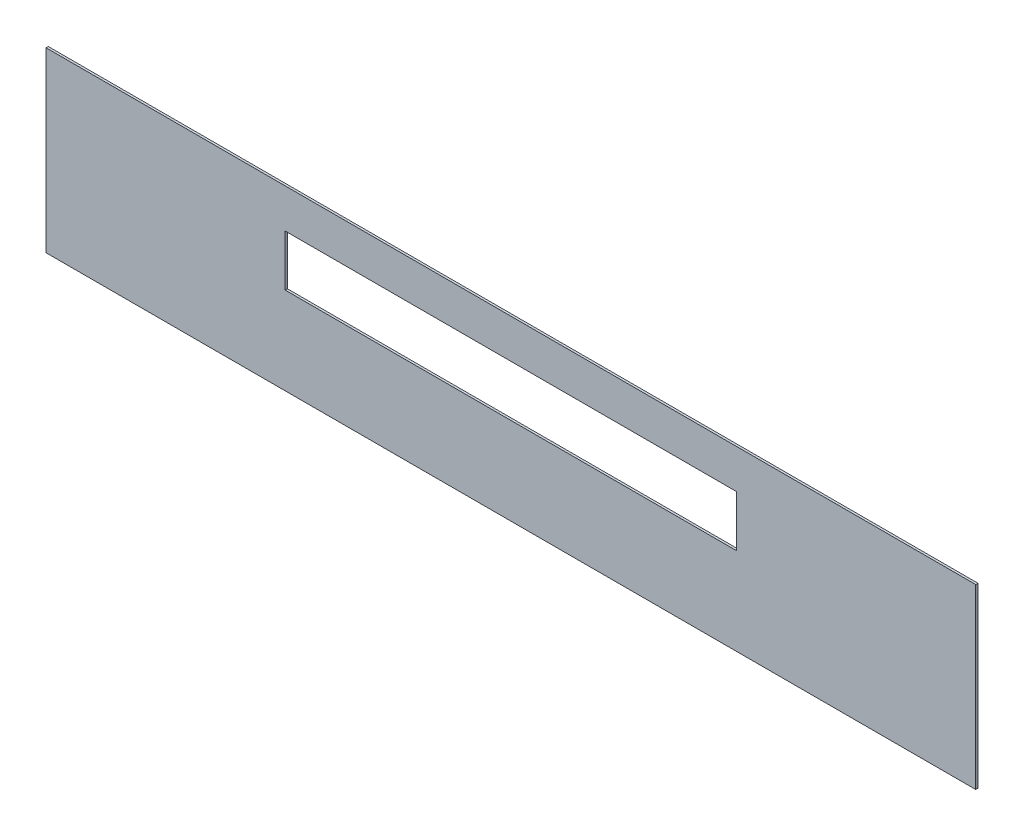
ISO-10303-21;
HEADER;
FILE_DESCRIPTION(('STEP AP214'),'2;1');
FILE_NAME('part.step','',(''),(''),'','','');
FILE_SCHEMA(('AUTOMOTIVE_DESIGN { 1 0 10303 214 1 1 1 1 }'));
ENDSEC;
DATA;
#1=APPLICATION_CONTEXT('core data for automotive mechanical design processes');
#2=APPLICATION_PROTOCOL_DEFINITION('international standard','automotive_design',2000,#1);
#3=PRODUCT_CONTEXT('',#1,'mechanical');
#4=PRODUCT('Part','Part','',(#3));
#5=PRODUCT_RELATED_PRODUCT_CATEGORY('part','',(#4));
#6=PRODUCT_DEFINITION_FORMATION('','',#4);
#7=PRODUCT_DEFINITION_CONTEXT('part definition',#1,'design');
#8=PRODUCT_DEFINITION('design','',#6,#7);
#9=PRODUCT_DEFINITION_SHAPE('','',#8);
#10=(LENGTH_UNIT() NAMED_UNIT(*) SI_UNIT(.MILLI.,.METRE.));
#11=(NAMED_UNIT(*) PLANE_ANGLE_UNIT() SI_UNIT($,.RADIAN.));
#12=(NAMED_UNIT(*) SI_UNIT($,.STERADIAN.) SOLID_ANGLE_UNIT());
#13=UNCERTAINTY_MEASURE_WITH_UNIT(LENGTH_MEASURE(1.E-05),#10,'distance_accuracy_value','');
#14=(GEOMETRIC_REPRESENTATION_CONTEXT(3) GLOBAL_UNCERTAINTY_ASSIGNED_CONTEXT((#13)) GLOBAL_UNIT_ASSIGNED_CONTEXT((#10,
#11,#12)) REPRESENTATION_CONTEXT('',''));
#15=CARTESIAN_POINT('',(0.,0.,0.));
#16=DIRECTION('',(0.,0.,1.));
#17=DIRECTION('',(1.,0.,0.));
#18=AXIS2_PLACEMENT_3D('',#15,#16,#17);
#19=CARTESIAN_POINT('',(0.,0.,40.));
#20=DIRECTION('',(0.,0.,-1.));
#21=DIRECTION('',(-1.,0.,0.));
#22=AXIS2_PLACEMENT_3D('',#19,#20,#21);
#23=PLANE('',#22);
#24=DIRECTION('',(0.,-1.,0.));
#25=VECTOR('',#24,1.);
#26=CARTESIAN_POINT('',(0.,0.,40.));
#27=LINE('',#26,#25);
#28=CARTESIAN_POINT('',(0.,118.,40.));
#29=VERTEX_POINT('',#28);
#30=CARTESIAN_POINT('',(0.,0.,40.));
#31=VERTEX_POINT('',#30);
#32=EDGE_CURVE('E126',#29,#31,#27,.T.);
#33=ORIENTED_EDGE('',*,*,#32,.T.);
#34=DIRECTION('',(1.,0.,0.));
#35=VECTOR('',#34,1.);
#36=CARTESIAN_POINT('',(0.,0.,40.));
#37=LINE('',#36,#35);
#38=CARTESIAN_POINT('',(618.,0.,40.));
#39=VERTEX_POINT('',#38);
#40=EDGE_CURVE('E129',#31,#39,#37,.T.);
#41=ORIENTED_EDGE('',*,*,#40,.T.);
#42=DIRECTION('',(0.,1.,0.));
#43=VECTOR('',#42,1.);
#44=CARTESIAN_POINT('',(618.,0.,40.));
#45=LINE('',#44,#43);
#46=CARTESIAN_POINT('',(618.,118.,40.));
#47=VERTEX_POINT('',#46);
#48=EDGE_CURVE('E132',#39,#47,#45,.T.);
#49=ORIENTED_EDGE('',*,*,#48,.T.);
#50=DIRECTION('',(-1.,0.,0.));
#51=VECTOR('',#50,1.);
#52=CARTESIAN_POINT('',(0.,118.,40.));
#53=LINE('',#52,#51);
#54=EDGE_CURVE('E134',#47,#29,#53,.T.);
#55=ORIENTED_EDGE('',*,*,#54,.T.);
#56=EDGE_LOOP('',(#33,#41,#49,#55));
#57=FACE_BOUND('',#56,.T.);
#58=DIRECTION('',(0.,-1.,0.));
#59=VECTOR('',#58,1.);
#60=CARTESIAN_POINT('',(159.,0.,40.));
#61=LINE('',#60,#59);
#62=CARTESIAN_POINT('',(159.,92.,40.));
#63=VERTEX_POINT('',#62);
#64=CARTESIAN_POINT('',(159.,58.,40.));
#65=VERTEX_POINT('',#64);
#66=EDGE_CURVE('E112',#63,#65,#61,.T.);
#67=ORIENTED_EDGE('',*,*,#66,.F.);
#68=DIRECTION('',(-1.,0.,0.));
#69=VECTOR('',#68,1.);
#70=CARTESIAN_POINT('',(0.,92.,40.));
#71=LINE('',#70,#69);
#72=CARTESIAN_POINT('',(459.,92.,40.));
#73=VERTEX_POINT('',#72);
#74=EDGE_CURVE('E101',#73,#63,#71,.T.);
#75=ORIENTED_EDGE('',*,*,#74,.F.);
#76=DIRECTION('',(0.,1.,0.));
#77=VECTOR('',#76,1.);
#78=CARTESIAN_POINT('',(459.,0.,40.));
#79=LINE('',#78,#77);
#80=CARTESIAN_POINT('',(459.,58.,40.));
#81=VERTEX_POINT('',#80);
#82=EDGE_CURVE('E106',#81,#73,#79,.T.);
#83=ORIENTED_EDGE('',*,*,#82,.F.);
#84=DIRECTION('',(1.,0.,0.));
#85=VECTOR('',#84,1.);
#86=CARTESIAN_POINT('',(0.,58.,40.));
#87=LINE('',#86,#85);
#88=EDGE_CURVE('E117',#65,#81,#87,.T.);
#89=ORIENTED_EDGE('',*,*,#88,.F.);
#90=EDGE_LOOP('',(#67,#75,#83,#89));
#91=FACE_BOUND('',#90,.T.);
#92=ADVANCED_FACE('F39',(#57,#91),#23,.F.);
#93=CARTESIAN_POINT('',(0.,0.,38.5));
#94=DIRECTION('',(0.,0.,-1.));
#95=DIRECTION('',(-1.,0.,0.));
#96=AXIS2_PLACEMENT_3D('',#93,#94,#95);
#97=PLANE('',#96);
#98=DIRECTION('',(0.,-1.,0.));
#99=VECTOR('',#98,1.);
#100=CARTESIAN_POINT('',(0.,0.,38.5));
#101=LINE('',#100,#99);
#102=CARTESIAN_POINT('',(0.,118.,38.5));
#103=VERTEX_POINT('',#102);
#104=CARTESIAN_POINT('',(0.,0.,38.5));
#105=VERTEX_POINT('',#104);
#106=EDGE_CURVE('E118',#103,#105,#101,.T.);
#107=ORIENTED_EDGE('',*,*,#106,.F.);
#108=DIRECTION('',(-1.,0.,0.));
#109=VECTOR('',#108,1.);
#110=CARTESIAN_POINT('',(0.,118.,38.5));
#111=LINE('',#110,#109);
#112=CARTESIAN_POINT('',(618.,118.,38.5));
#113=VERTEX_POINT('',#112);
#114=EDGE_CURVE('E130',#113,#103,#111,.T.);
#115=ORIENTED_EDGE('',*,*,#114,.F.);
#116=DIRECTION('',(0.,1.,0.));
#117=VECTOR('',#116,1.);
#118=CARTESIAN_POINT('',(618.,0.,38.5));
#119=LINE('',#118,#117);
#120=CARTESIAN_POINT('',(618.,0.,38.5));
#121=VERTEX_POINT('',#120);
#122=EDGE_CURVE('E138',#121,#113,#119,.T.);
#123=ORIENTED_EDGE('',*,*,#122,.F.);
#124=DIRECTION('',(1.,0.,0.));
#125=VECTOR('',#124,1.);
#126=CARTESIAN_POINT('',(0.,0.,38.5));
#127=LINE('',#126,#125);
#128=EDGE_CURVE('E121',#105,#121,#127,.T.);
#129=ORIENTED_EDGE('',*,*,#128,.F.);
#130=EDGE_LOOP('',(#107,#115,#123,#129));
#131=FACE_BOUND('',#130,.T.);
#132=DIRECTION('',(-1.,0.,0.));
#133=VECTOR('',#132,1.);
#134=CARTESIAN_POINT('',(0.,92.,38.5));
#135=LINE('',#134,#133);
#136=CARTESIAN_POINT('',(459.,92.,38.5));
#137=VERTEX_POINT('',#136);
#138=CARTESIAN_POINT('',(159.,92.,38.5));
#139=VERTEX_POINT('',#138);
#140=EDGE_CURVE('E152',#137,#139,#135,.T.);
#141=ORIENTED_EDGE('',*,*,#140,.T.);
#142=DIRECTION('',(0.,-1.,0.));
#143=VECTOR('',#142,1.);
#144=CARTESIAN_POINT('',(159.,0.,38.5));
#145=LINE('',#144,#143);
#146=CARTESIAN_POINT('',(159.,58.,38.5));
#147=VERTEX_POINT('',#146);
#148=EDGE_CURVE('E11',#139,#147,#145,.T.);
#149=ORIENTED_EDGE('',*,*,#148,.T.);
#150=DIRECTION('',(1.,0.,0.));
#151=VECTOR('',#150,1.);
#152=CARTESIAN_POINT('',(0.,58.,38.5));
#153=LINE('',#152,#151);
#154=CARTESIAN_POINT('',(459.,58.,38.5));
#155=VERTEX_POINT('',#154);
#156=EDGE_CURVE('E47',#147,#155,#153,.T.);
#157=ORIENTED_EDGE('',*,*,#156,.T.);
#158=DIRECTION('',(0.,1.,0.));
#159=VECTOR('',#158,1.);
#160=CARTESIAN_POINT('',(459.,0.,38.5));
#161=LINE('',#160,#159);
#162=EDGE_CURVE('E154',#155,#137,#161,.T.);
#163=ORIENTED_EDGE('',*,*,#162,.T.);
#164=EDGE_LOOP('',(#141,#149,#157,#163));
#165=FACE_BOUND('',#164,.T.);
#166=ADVANCED_FACE('F158',(#131,#165),#97,.T.);
#167=CARTESIAN_POINT('',(0.,0.,40.));
#168=DIRECTION('',(1.,0.,0.));
#169=DIRECTION('',(0.,0.,-1.));
#170=AXIS2_PLACEMENT_3D('',#167,#168,#169);
#171=PLANE('',#170);
#172=ORIENTED_EDGE('',*,*,#106,.T.);
#173=DIRECTION('',(0.,0.,-1.));
#174=VECTOR('',#173,1.);
#175=CARTESIAN_POINT('',(0.,0.,40.));
#176=LINE('',#175,#174);
#177=EDGE_CURVE('E149',#31,#105,#176,.T.);
#178=ORIENTED_EDGE('',*,*,#177,.F.);
#179=ORIENTED_EDGE('',*,*,#32,.F.);
#180=DIRECTION('',(0.,0.,-1.));
#181=VECTOR('',#180,1.);
#182=CARTESIAN_POINT('',(0.,118.,40.));
#183=LINE('',#182,#181);
#184=EDGE_CURVE('E135',#29,#103,#183,.T.);
#185=ORIENTED_EDGE('',*,*,#184,.T.);
#186=EDGE_LOOP('',(#172,#178,#179,#185));
#187=FACE_BOUND('',#186,.T.);
#188=ADVANCED_FACE('F41',(#187),#171,.F.);
#189=CARTESIAN_POINT('',(0.,0.,40.));
#190=DIRECTION('',(0.,1.,0.));
#191=DIRECTION('',(0.,0.,1.));
#192=AXIS2_PLACEMENT_3D('',#189,#190,#191);
#193=PLANE('',#192);
#194=ORIENTED_EDGE('',*,*,#128,.T.);
#195=DIRECTION('',(0.,0.,-1.));
#196=VECTOR('',#195,1.);
#197=CARTESIAN_POINT('',(618.,0.,40.));
#198=LINE('',#197,#196);
#199=EDGE_CURVE('E146',#39,#121,#198,.T.);
#200=ORIENTED_EDGE('',*,*,#199,.F.);
#201=ORIENTED_EDGE('',*,*,#40,.F.);
#202=ORIENTED_EDGE('',*,*,#177,.T.);
#203=EDGE_LOOP('',(#194,#200,#201,#202));
#204=FACE_BOUND('',#203,.T.);
#205=ADVANCED_FACE('F193',(#204),#193,.F.);
#206=CARTESIAN_POINT('',(618.,0.,40.));
#207=DIRECTION('',(-1.,0.,0.));
#208=DIRECTION('',(0.,0.,1.));
#209=AXIS2_PLACEMENT_3D('',#206,#207,#208);
#210=PLANE('',#209);
#211=ORIENTED_EDGE('',*,*,#122,.T.);
#212=DIRECTION('',(0.,0.,-1.));
#213=VECTOR('',#212,1.);
#214=CARTESIAN_POINT('',(618.,118.,40.));
#215=LINE('',#214,#213);
#216=EDGE_CURVE('E143',#47,#113,#215,.T.);
#217=ORIENTED_EDGE('',*,*,#216,.F.);
#218=ORIENTED_EDGE('',*,*,#48,.F.);
#219=ORIENTED_EDGE('',*,*,#199,.T.);
#220=EDGE_LOOP('',(#211,#217,#218,#219));
#221=FACE_BOUND('',#220,.T.);
#222=ADVANCED_FACE('F190',(#221),#210,.F.);
#223=CARTESIAN_POINT('',(0.,118.,40.));
#224=DIRECTION('',(0.,-1.,0.));
#225=DIRECTION('',(0.,0.,-1.));
#226=AXIS2_PLACEMENT_3D('',#223,#224,#225);
#227=PLANE('',#226);
#228=ORIENTED_EDGE('',*,*,#114,.T.);
#229=ORIENTED_EDGE('',*,*,#184,.F.);
#230=ORIENTED_EDGE('',*,*,#54,.F.);
#231=ORIENTED_EDGE('',*,*,#216,.T.);
#232=EDGE_LOOP('',(#228,#229,#230,#231));
#233=FACE_BOUND('',#232,.T.);
#234=ADVANCED_FACE('F188',(#233),#227,.F.);
#235=CARTESIAN_POINT('',(159.,58.,41.));
#236=DIRECTION('',(1.,0.,0.));
#237=DIRECTION('',(0.,0.,-1.));
#238=AXIS2_PLACEMENT_3D('',#235,#236,#237);
#239=PLANE('',#238);
#240=ORIENTED_EDGE('',*,*,#66,.T.);
#241=DIRECTION('',(0.,0.,-1.));
#242=VECTOR('',#241,1.);
#243=CARTESIAN_POINT('',(159.,58.,41.));
#244=LINE('',#243,#242);
#245=EDGE_CURVE('E107',#65,#147,#244,.T.);
#246=ORIENTED_EDGE('',*,*,#245,.T.);
#247=ORIENTED_EDGE('',*,*,#148,.F.);
#248=DIRECTION('',(0.,0.,-1.));
#249=VECTOR('',#248,1.);
#250=CARTESIAN_POINT('',(159.,92.,41.));
#251=LINE('',#250,#249);
#252=EDGE_CURVE('E59',#63,#139,#251,.T.);
#253=ORIENTED_EDGE('',*,*,#252,.F.);
#254=EDGE_LOOP('',(#240,#246,#247,#253));
#255=FACE_BOUND('',#254,.T.);
#256=ADVANCED_FACE('F110',(#255),#239,.T.);
#257=CARTESIAN_POINT('',(159.,58.,41.));
#258=DIRECTION('',(0.,1.,0.));
#259=DIRECTION('',(0.,0.,1.));
#260=AXIS2_PLACEMENT_3D('',#257,#258,#259);
#261=PLANE('',#260);
#262=ORIENTED_EDGE('',*,*,#88,.T.);
#263=DIRECTION('',(0.,0.,-1.));
#264=VECTOR('',#263,1.);
#265=CARTESIAN_POINT('',(459.,58.,41.));
#266=LINE('',#265,#264);
#267=EDGE_CURVE('E163',#81,#155,#266,.T.);
#268=ORIENTED_EDGE('',*,*,#267,.T.);
#269=ORIENTED_EDGE('',*,*,#156,.F.);
#270=ORIENTED_EDGE('',*,*,#245,.F.);
#271=EDGE_LOOP('',(#262,#268,#269,#270));
#272=FACE_BOUND('',#271,.T.);
#273=ADVANCED_FACE('F161',(#272),#261,.T.);
#274=CARTESIAN_POINT('',(459.,58.,41.));
#275=DIRECTION('',(-1.,0.,0.));
#276=DIRECTION('',(0.,0.,1.));
#277=AXIS2_PLACEMENT_3D('',#274,#275,#276);
#278=PLANE('',#277);
#279=ORIENTED_EDGE('',*,*,#82,.T.);
#280=DIRECTION('',(0.,0.,-1.));
#281=VECTOR('',#280,1.);
#282=CARTESIAN_POINT('',(459.,92.,41.));
#283=LINE('',#282,#281);
#284=EDGE_CURVE('E54',#73,#137,#283,.T.);
#285=ORIENTED_EDGE('',*,*,#284,.T.);
#286=ORIENTED_EDGE('',*,*,#162,.F.);
#287=ORIENTED_EDGE('',*,*,#267,.F.);
#288=EDGE_LOOP('',(#279,#285,#286,#287));
#289=FACE_BOUND('',#288,.T.);
#290=ADVANCED_FACE('F168',(#289),#278,.T.);
#291=CARTESIAN_POINT('',(159.,92.,41.));
#292=DIRECTION('',(0.,-1.,0.));
#293=DIRECTION('',(0.,0.,-1.));
#294=AXIS2_PLACEMENT_3D('',#291,#292,#293);
#295=PLANE('',#294);
#296=ORIENTED_EDGE('',*,*,#74,.T.);
#297=ORIENTED_EDGE('',*,*,#252,.T.);
#298=ORIENTED_EDGE('',*,*,#140,.F.);
#299=ORIENTED_EDGE('',*,*,#284,.F.);
#300=EDGE_LOOP('',(#296,#297,#298,#299));
#301=FACE_BOUND('',#300,.T.);
#302=ADVANCED_FACE('F102',(#301),#295,.T.);
#303=CLOSED_SHELL('',(#92,#166,#188,#205,#222,#234,#256,#273,#290,#302));
#304=MANIFOLD_SOLID_BREP('B2',#303);
#305=ADVANCED_BREP_SHAPE_REPRESENTATION('',(#18,#304),#14);
#306=SHAPE_DEFINITION_REPRESENTATION(#9,#305);
ENDSEC;
END-ISO-10303-21;
